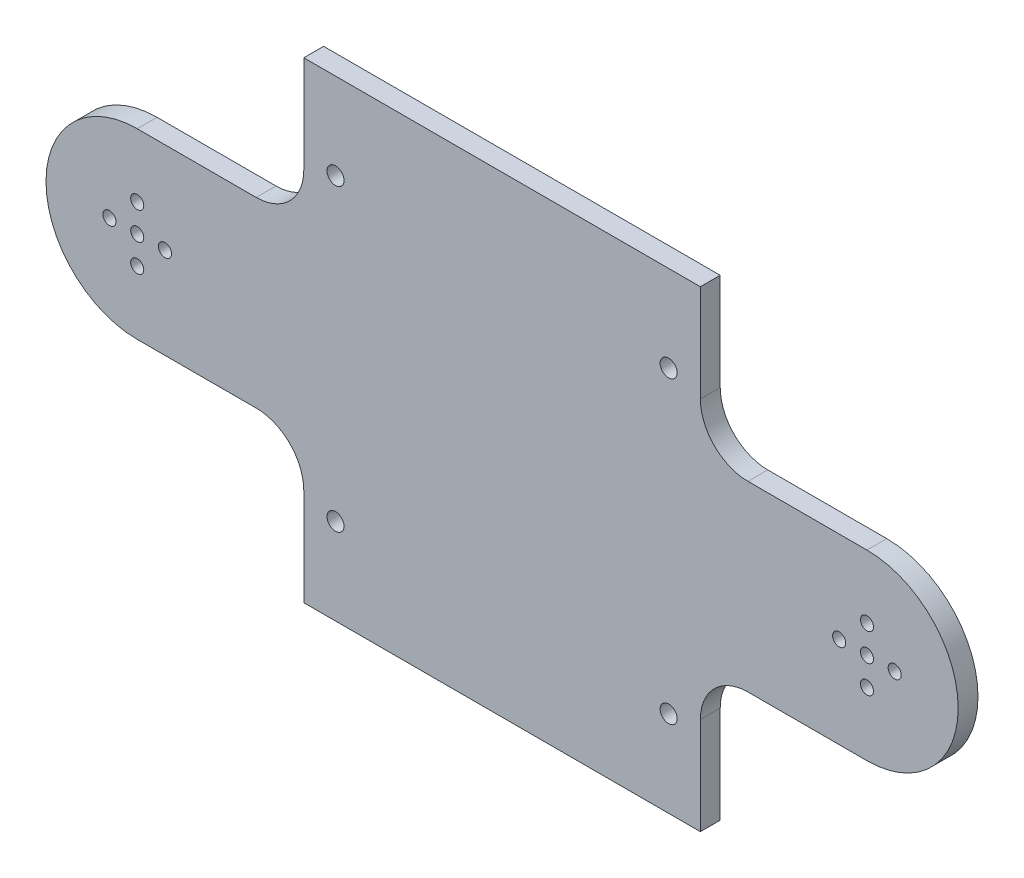
ISO-10303-21;
HEADER;
FILE_DESCRIPTION(('STEP AP214'),'2;1');
FILE_NAME('part.step','',(''),(''),'','','');
FILE_SCHEMA(('AUTOMOTIVE_DESIGN { 1 0 10303 214 1 1 1 1 }'));
ENDSEC;
DATA;
#1=APPLICATION_CONTEXT('core data for automotive mechanical design processes');
#2=APPLICATION_PROTOCOL_DEFINITION('international standard','automotive_design',2000,#1);
#3=PRODUCT_CONTEXT('',#1,'mechanical');
#4=PRODUCT('Part','Part','',(#3));
#5=PRODUCT_RELATED_PRODUCT_CATEGORY('part','',(#4));
#6=PRODUCT_DEFINITION_FORMATION('','',#4);
#7=PRODUCT_DEFINITION_CONTEXT('part definition',#1,'design');
#8=PRODUCT_DEFINITION('design','',#6,#7);
#9=PRODUCT_DEFINITION_SHAPE('','',#8);
#10=(LENGTH_UNIT() NAMED_UNIT(*) SI_UNIT(.MILLI.,.METRE.));
#11=(NAMED_UNIT(*) PLANE_ANGLE_UNIT() SI_UNIT($,.RADIAN.));
#12=(NAMED_UNIT(*) SI_UNIT($,.STERADIAN.) SOLID_ANGLE_UNIT());
#13=UNCERTAINTY_MEASURE_WITH_UNIT(LENGTH_MEASURE(1.E-05),#10,'distance_accuracy_value','');
#14=(GEOMETRIC_REPRESENTATION_CONTEXT(3) GLOBAL_UNCERTAINTY_ASSIGNED_CONTEXT((#13)) GLOBAL_UNIT_ASSIGNED_CONTEXT((#10,
#11,#12)) REPRESENTATION_CONTEXT('',''));
#15=CARTESIAN_POINT('',(0.,0.,0.));
#16=DIRECTION('',(0.,0.,1.));
#17=DIRECTION('',(1.,0.,0.));
#18=AXIS2_PLACEMENT_3D('',#15,#16,#17);
#19=CARTESIAN_POINT('',(-70.9669552143138,59.5010284958712,-0.00999999999999959));
#20=DIRECTION('',(0.,-1.,0.));
#21=DIRECTION('',(0.,0.,-1.));
#22=AXIS2_PLACEMENT_3D('',#19,#20,#21);
#23=PLANE('',#22);
#24=DIRECTION('',(1.,0.,0.));
#25=VECTOR('',#24,1.);
#26=CARTESIAN_POINT('',(-92.,59.5010284958712,0.));
#27=LINE('',#26,#25);
#28=CARTESIAN_POINT('',(-50.,59.5010284958712,0.));
#29=VERTEX_POINT('',#28);
#30=CARTESIAN_POINT('',(50.,59.5010284958712,0.));
#31=VERTEX_POINT('',#30);
#32=EDGE_CURVE('E205',#29,#31,#27,.T.);
#33=ORIENTED_EDGE('',*,*,#32,.F.);
#34=DIRECTION('',(0.,0.,-1.));
#35=VECTOR('',#34,1.);
#36=CARTESIAN_POINT('',(-50.,59.5010284958712,5.));
#37=LINE('',#36,#35);
#38=CARTESIAN_POINT('',(-50.,59.5010284958712,5.));
#39=VERTEX_POINT('',#38);
#40=EDGE_CURVE('E187',#39,#29,#37,.T.);
#41=ORIENTED_EDGE('',*,*,#40,.F.);
#42=DIRECTION('',(1.,0.,0.));
#43=VECTOR('',#42,1.);
#44=CARTESIAN_POINT('',(-92.,59.5010284958712,5.));
#45=LINE('',#44,#43);
#46=CARTESIAN_POINT('',(50.,59.5010284958712,5.));
#47=VERTEX_POINT('',#46);
#48=EDGE_CURVE('E197',#39,#47,#45,.T.);
#49=ORIENTED_EDGE('',*,*,#48,.T.);
#50=DIRECTION('',(0.,0.,1.));
#51=VECTOR('',#50,1.);
#52=CARTESIAN_POINT('',(50.,59.5010284958712,5.));
#53=LINE('',#52,#51);
#54=EDGE_CURVE('E191',#31,#47,#53,.T.);
#55=ORIENTED_EDGE('',*,*,#54,.F.);
#56=EDGE_LOOP('',(#33,#41,#49,#55));
#57=FACE_BOUND('',#56,.T.);
#58=ADVANCED_FACE('F43',(#57),#23,.F.);
#59=CARTESIAN_POINT('',(-70.9669552143138,-59.5010284958712,-0.00999999999999959));
#60=DIRECTION('',(0.,-1.,0.));
#61=DIRECTION('',(0.,0.,-1.));
#62=AXIS2_PLACEMENT_3D('',#59,#60,#61);
#63=PLANE('',#62);
#64=DIRECTION('',(1.,0.,0.));
#65=VECTOR('',#64,1.);
#66=CARTESIAN_POINT('',(-92.,-59.5010284958712,5.));
#67=LINE('',#66,#65);
#68=CARTESIAN_POINT('',(-50.,-59.5010284958712,5.));
#69=VERTEX_POINT('',#68);
#70=CARTESIAN_POINT('',(50.,-59.5010284958712,5.));
#71=VERTEX_POINT('',#70);
#72=EDGE_CURVE('E202',#69,#71,#67,.T.);
#73=ORIENTED_EDGE('',*,*,#72,.F.);
#74=DIRECTION('',(0.,0.,-1.));
#75=VECTOR('',#74,1.);
#76=CARTESIAN_POINT('',(-50.,-59.5010284958712,5.));
#77=LINE('',#76,#75);
#78=CARTESIAN_POINT('',(-50.,-59.5010284958712,0.));
#79=VERTEX_POINT('',#78);
#80=EDGE_CURVE('E46',#69,#79,#77,.T.);
#81=ORIENTED_EDGE('',*,*,#80,.T.);
#82=DIRECTION('',(1.,0.,0.));
#83=VECTOR('',#82,1.);
#84=CARTESIAN_POINT('',(-92.,-59.5010284958712,0.));
#85=LINE('',#84,#83);
#86=CARTESIAN_POINT('',(50.,-59.5010284958712,0.));
#87=VERTEX_POINT('',#86);
#88=EDGE_CURVE('E201',#79,#87,#85,.T.);
#89=ORIENTED_EDGE('',*,*,#88,.T.);
#90=DIRECTION('',(0.,0.,1.));
#91=VECTOR('',#90,1.);
#92=CARTESIAN_POINT('',(50.,-59.5010284958712,5.));
#93=LINE('',#92,#91);
#94=EDGE_CURVE('E11',#87,#71,#93,.T.);
#95=ORIENTED_EDGE('',*,*,#94,.T.);
#96=EDGE_LOOP('',(#73,#81,#89,#95));
#97=FACE_BOUND('',#96,.T.);
#98=ADVANCED_FACE('F216',(#97),#63,.T.);
#99=CARTESIAN_POINT('',(62.,-23.0010284958712,5.));
#100=DIRECTION('',(0.,1.,0.));
#101=DIRECTION('',(-1.,0.,0.));
#102=AXIS2_PLACEMENT_3D('',#99,#100,#101);
#103=PLANE('',#102);
#104=DIRECTION('',(1.,0.,0.));
#105=VECTOR('',#104,1.);
#106=CARTESIAN_POINT('',(62.,-23.0010284958712,0.));
#107=LINE('',#106,#105);
#108=CARTESIAN_POINT('',(62.,-23.0010284958712,0.));
#109=VERTEX_POINT('',#108);
#110=CARTESIAN_POINT('',(92.,-23.0010284958712,0.));
#111=VERTEX_POINT('',#110);
#112=EDGE_CURVE('E359',#109,#111,#107,.T.);
#113=ORIENTED_EDGE('',*,*,#112,.T.);
#114=DIRECTION('',(0.,0.,-1.));
#115=VECTOR('',#114,1.);
#116=CARTESIAN_POINT('',(92.,-23.0010284958712,5.));
#117=LINE('',#116,#115);
#118=CARTESIAN_POINT('',(92.,-23.0010284958712,5.));
#119=VERTEX_POINT('',#118);
#120=EDGE_CURVE('E300',#119,#111,#117,.T.);
#121=ORIENTED_EDGE('',*,*,#120,.F.);
#122=DIRECTION('',(1.,0.,0.));
#123=VECTOR('',#122,1.);
#124=CARTESIAN_POINT('',(62.,-23.0010284958712,5.));
#125=LINE('',#124,#123);
#126=CARTESIAN_POINT('',(62.,-23.0010284958712,5.));
#127=VERTEX_POINT('',#126);
#128=EDGE_CURVE('E333',#127,#119,#125,.T.);
#129=ORIENTED_EDGE('',*,*,#128,.F.);
#130=DIRECTION('',(0.,0.,-1.));
#131=VECTOR('',#130,1.);
#132=CARTESIAN_POINT('',(62.,-23.0010284958712,5.));
#133=LINE('',#132,#131);
#134=EDGE_CURVE('E304',#127,#109,#133,.T.);
#135=ORIENTED_EDGE('',*,*,#134,.T.);
#136=EDGE_LOOP('',(#113,#121,#129,#135));
#137=FACE_BOUND('',#136,.T.);
#138=ADVANCED_FACE('F252',(#137),#103,.F.);
#139=CARTESIAN_POINT('',(92.,0.,5.));
#140=DIRECTION('',(0.,0.,-1.));
#141=DIRECTION('',(-1.,0.,0.));
#142=AXIS2_PLACEMENT_3D('',#139,#140,#141);
#143=CYLINDRICAL_SURFACE('',#142,23.0010284958712);
#144=CARTESIAN_POINT('',(92.,0.,0.));
#145=DIRECTION('',(0.,0.,1.));
#146=DIRECTION('',(-1.,0.,0.));
#147=AXIS2_PLACEMENT_3D('',#144,#145,#146);
#148=CIRCLE('',#147,23.0010284958712);
#149=CARTESIAN_POINT('',(92.,23.0010284958712,0.));
#150=VERTEX_POINT('',#149);
#151=EDGE_CURVE('E362',#111,#150,#148,.T.);
#152=ORIENTED_EDGE('',*,*,#151,.T.);
#153=DIRECTION('',(0.,0.,-1.));
#154=VECTOR('',#153,1.);
#155=CARTESIAN_POINT('',(92.,23.0010284958712,5.));
#156=LINE('',#155,#154);
#157=CARTESIAN_POINT('',(92.,23.0010284958712,5.));
#158=VERTEX_POINT('',#157);
#159=EDGE_CURVE('E296',#158,#150,#156,.T.);
#160=ORIENTED_EDGE('',*,*,#159,.F.);
#161=CARTESIAN_POINT('',(92.,0.,5.));
#162=DIRECTION('',(0.,0.,1.));
#163=DIRECTION('',(-1.,0.,0.));
#164=AXIS2_PLACEMENT_3D('',#161,#162,#163);
#165=CIRCLE('',#164,23.0010284958712);
#166=EDGE_CURVE('E330',#119,#158,#165,.T.);
#167=ORIENTED_EDGE('',*,*,#166,.F.);
#168=ORIENTED_EDGE('',*,*,#120,.T.);
#169=EDGE_LOOP('',(#152,#160,#167,#168));
#170=FACE_BOUND('',#169,.T.);
#171=ADVANCED_FACE('F385',(#170),#143,.T.);
#172=CARTESIAN_POINT('',(62.,23.0010284958712,5.));
#173=DIRECTION('',(0.,-1.,0.));
#174=DIRECTION('',(1.,0.,0.));
#175=AXIS2_PLACEMENT_3D('',#172,#173,#174);
#176=PLANE('',#175);
#177=DIRECTION('',(-1.,0.,0.));
#178=VECTOR('',#177,1.);
#179=CARTESIAN_POINT('',(62.,23.0010284958712,0.));
#180=LINE('',#179,#178);
#181=CARTESIAN_POINT('',(62.,23.0010284958712,0.));
#182=VERTEX_POINT('',#181);
#183=EDGE_CURVE('E365',#150,#182,#180,.T.);
#184=ORIENTED_EDGE('',*,*,#183,.T.);
#185=DIRECTION('',(0.,0.,-1.));
#186=VECTOR('',#185,1.);
#187=CARTESIAN_POINT('',(62.,23.0010284958712,5.));
#188=LINE('',#187,#186);
#189=CARTESIAN_POINT('',(62.,23.0010284958712,5.));
#190=VERTEX_POINT('',#189);
#191=EDGE_CURVE('E292',#190,#182,#188,.T.);
#192=ORIENTED_EDGE('',*,*,#191,.F.);
#193=DIRECTION('',(-1.,0.,0.));
#194=VECTOR('',#193,1.);
#195=CARTESIAN_POINT('',(62.,23.0010284958712,5.));
#196=LINE('',#195,#194);
#197=EDGE_CURVE('E327',#158,#190,#196,.T.);
#198=ORIENTED_EDGE('',*,*,#197,.F.);
#199=ORIENTED_EDGE('',*,*,#159,.T.);
#200=EDGE_LOOP('',(#184,#192,#198,#199));
#201=FACE_BOUND('',#200,.T.);
#202=ADVANCED_FACE('F381',(#201),#176,.F.);
#203=CARTESIAN_POINT('',(-62.,23.0010284958712,5.));
#204=DIRECTION('',(0.,-1.,0.));
#205=DIRECTION('',(1.,0.,0.));
#206=AXIS2_PLACEMENT_3D('',#203,#204,#205);
#207=PLANE('',#206);
#208=DIRECTION('',(-1.,0.,0.));
#209=VECTOR('',#208,1.);
#210=CARTESIAN_POINT('',(-62.,23.0010284958712,0.));
#211=LINE('',#210,#209);
#212=CARTESIAN_POINT('',(-62.,23.0010284958712,0.));
#213=VERTEX_POINT('',#212);
#214=CARTESIAN_POINT('',(-92.,23.0010284958712,0.));
#215=VERTEX_POINT('',#214);
#216=EDGE_CURVE('E181',#213,#215,#211,.T.);
#217=ORIENTED_EDGE('',*,*,#216,.T.);
#218=DIRECTION('',(0.,0.,-1.));
#219=VECTOR('',#218,1.);
#220=CARTESIAN_POINT('',(-92.,23.0010284958712,5.));
#221=LINE('',#220,#219);
#222=CARTESIAN_POINT('',(-92.,23.0010284958712,5.));
#223=VERTEX_POINT('',#222);
#224=EDGE_CURVE('E278',#223,#215,#221,.T.);
#225=ORIENTED_EDGE('',*,*,#224,.F.);
#226=DIRECTION('',(-1.,0.,0.));
#227=VECTOR('',#226,1.);
#228=CARTESIAN_POINT('',(-62.,23.0010284958712,5.));
#229=LINE('',#228,#227);
#230=CARTESIAN_POINT('',(-62.,23.0010284958712,5.));
#231=VERTEX_POINT('',#230);
#232=EDGE_CURVE('E176',#231,#223,#229,.T.);
#233=ORIENTED_EDGE('',*,*,#232,.F.);
#234=DIRECTION('',(0.,0.,-1.));
#235=VECTOR('',#234,1.);
#236=CARTESIAN_POINT('',(-62.,23.0010284958712,5.));
#237=LINE('',#236,#235);
#238=EDGE_CURVE('E281',#231,#213,#237,.T.);
#239=ORIENTED_EDGE('',*,*,#238,.T.);
#240=EDGE_LOOP('',(#217,#225,#233,#239));
#241=FACE_BOUND('',#240,.T.);
#242=ADVANCED_FACE('F414',(#241),#207,.F.);
#243=CARTESIAN_POINT('',(-92.,0.,5.));
#244=DIRECTION('',(0.,0.,-1.));
#245=DIRECTION('',(-1.,0.,0.));
#246=AXIS2_PLACEMENT_3D('',#243,#244,#245);
#247=CYLINDRICAL_SURFACE('',#246,23.0010284958712);
#248=CARTESIAN_POINT('',(-92.,0.,0.));
#249=DIRECTION('',(0.,0.,1.));
#250=DIRECTION('',(1.,0.,0.));
#251=AXIS2_PLACEMENT_3D('',#248,#249,#250);
#252=CIRCLE('',#251,23.0010284958712);
#253=CARTESIAN_POINT('',(-92.,-23.0010284958712,0.));
#254=VERTEX_POINT('',#253);
#255=EDGE_CURVE('E185',#215,#254,#252,.T.);
#256=ORIENTED_EDGE('',*,*,#255,.T.);
#257=DIRECTION('',(0.,0.,-1.));
#258=VECTOR('',#257,1.);
#259=CARTESIAN_POINT('',(-92.,-23.0010284958712,5.));
#260=LINE('',#259,#258);
#261=CARTESIAN_POINT('',(-92.,-23.0010284958712,5.));
#262=VERTEX_POINT('',#261);
#263=EDGE_CURVE('E163',#262,#254,#260,.T.);
#264=ORIENTED_EDGE('',*,*,#263,.F.);
#265=CARTESIAN_POINT('',(-92.,0.,5.));
#266=DIRECTION('',(0.,0.,1.));
#267=DIRECTION('',(1.,0.,0.));
#268=AXIS2_PLACEMENT_3D('',#265,#266,#267);
#269=CIRCLE('',#268,23.0010284958712);
#270=EDGE_CURVE('E171',#223,#262,#269,.T.);
#271=ORIENTED_EDGE('',*,*,#270,.F.);
#272=ORIENTED_EDGE('',*,*,#224,.T.);
#273=EDGE_LOOP('',(#256,#264,#271,#272));
#274=FACE_BOUND('',#273,.T.);
#275=ADVANCED_FACE('F183',(#274),#247,.T.);
#276=CARTESIAN_POINT('',(-62.,-23.0010284958712,5.));
#277=DIRECTION('',(0.,1.,0.));
#278=DIRECTION('',(-1.,0.,0.));
#279=AXIS2_PLACEMENT_3D('',#276,#277,#278);
#280=PLANE('',#279);
#281=DIRECTION('',(1.,0.,0.));
#282=VECTOR('',#281,1.);
#283=CARTESIAN_POINT('',(-62.,-23.0010284958712,0.));
#284=LINE('',#283,#282);
#285=CARTESIAN_POINT('',(-62.,-23.0010284958712,0.));
#286=VERTEX_POINT('',#285);
#287=EDGE_CURVE('E348',#254,#286,#284,.T.);
#288=ORIENTED_EDGE('',*,*,#287,.T.);
#289=DIRECTION('',(0.,0.,-1.));
#290=VECTOR('',#289,1.);
#291=CARTESIAN_POINT('',(-62.,-23.0010284958712,5.));
#292=LINE('',#291,#290);
#293=CARTESIAN_POINT('',(-62.,-23.0010284958712,5.));
#294=VERTEX_POINT('',#293);
#295=EDGE_CURVE('E166',#294,#286,#292,.T.);
#296=ORIENTED_EDGE('',*,*,#295,.F.);
#297=DIRECTION('',(1.,0.,0.));
#298=VECTOR('',#297,1.);
#299=CARTESIAN_POINT('',(-62.,-23.0010284958712,5.));
#300=LINE('',#299,#298);
#301=EDGE_CURVE('E159',#262,#294,#300,.T.);
#302=ORIENTED_EDGE('',*,*,#301,.F.);
#303=ORIENTED_EDGE('',*,*,#263,.T.);
#304=EDGE_LOOP('',(#288,#296,#302,#303));
#305=FACE_BOUND('',#304,.T.);
#306=ADVANCED_FACE('F161',(#305),#280,.F.);
#307=CARTESIAN_POINT('',(42.,-37.748971504128,0.));
#308=DIRECTION('',(0.,0.,1.));
#309=DIRECTION('',(1.,0.,0.));
#310=AXIS2_PLACEMENT_3D('',#307,#308,#309);
#311=CYLINDRICAL_SURFACE('',#310,2.15);
#312=CARTESIAN_POINT('',(42.,-37.748971504128,0.));
#313=DIRECTION('',(0.,0.,1.));
#314=DIRECTION('',(-1.,0.,0.));
#315=AXIS2_PLACEMENT_3D('',#312,#313,#314);
#316=CIRCLE('',#315,2.15);
#317=CARTESIAN_POINT('',(39.85,-37.748971504128,0.));
#318=VERTEX_POINT('',#317);
#319=EDGE_CURVE('E834',#318,#318,#316,.T.);
#320=ORIENTED_EDGE('',*,*,#319,.F.);
#321=EDGE_LOOP('',(#320));
#322=FACE_BOUND('',#321,.T.);
#323=CARTESIAN_POINT('',(42.,-37.748971504128,5.));
#324=DIRECTION('',(0.,0.,1.));
#325=DIRECTION('',(-1.,0.,0.));
#326=AXIS2_PLACEMENT_3D('',#323,#324,#325);
#327=CIRCLE('',#326,2.15);
#328=CARTESIAN_POINT('',(39.85,-37.748971504128,5.));
#329=VERTEX_POINT('',#328);
#330=EDGE_CURVE('E836',#329,#329,#327,.T.);
#331=ORIENTED_EDGE('',*,*,#330,.T.);
#332=EDGE_LOOP('',(#331));
#333=FACE_BOUND('',#332,.T.);
#334=ADVANCED_FACE('F412',(#322,#333),#311,.F.);
#335=CARTESIAN_POINT('',(42.,37.748971504128,0.));
#336=DIRECTION('',(0.,0.,1.));
#337=DIRECTION('',(1.,0.,0.));
#338=AXIS2_PLACEMENT_3D('',#335,#336,#337);
#339=CYLINDRICAL_SURFACE('',#338,2.15);
#340=CARTESIAN_POINT('',(42.,37.748971504128,0.));
#341=DIRECTION('',(0.,0.,1.));
#342=DIRECTION('',(1.,0.,0.));
#343=AXIS2_PLACEMENT_3D('',#340,#341,#342);
#344=CIRCLE('',#343,2.15);
#345=CARTESIAN_POINT('',(44.15,37.748971504128,0.));
#346=VERTEX_POINT('',#345);
#347=EDGE_CURVE('E831',#346,#346,#344,.T.);
#348=ORIENTED_EDGE('',*,*,#347,.F.);
#349=EDGE_LOOP('',(#348));
#350=FACE_BOUND('',#349,.T.);
#351=CARTESIAN_POINT('',(42.,37.748971504128,5.));
#352=DIRECTION('',(0.,0.,1.));
#353=DIRECTION('',(1.,0.,0.));
#354=AXIS2_PLACEMENT_3D('',#351,#352,#353);
#355=CIRCLE('',#354,2.15);
#356=CARTESIAN_POINT('',(44.15,37.748971504128,5.));
#357=VERTEX_POINT('',#356);
#358=EDGE_CURVE('E837',#357,#357,#355,.T.);
#359=ORIENTED_EDGE('',*,*,#358,.T.);
#360=EDGE_LOOP('',(#359));
#361=FACE_BOUND('',#360,.T.);
#362=ADVANCED_FACE('F476',(#350,#361),#339,.F.);
#363=CARTESIAN_POINT('',(-42.,37.748971504128,0.));
#364=DIRECTION('',(0.,0.,1.));
#365=DIRECTION('',(1.,0.,0.));
#366=AXIS2_PLACEMENT_3D('',#363,#364,#365);
#367=CYLINDRICAL_SURFACE('',#366,2.15);
#368=CARTESIAN_POINT('',(-42.,37.748971504128,0.));
#369=DIRECTION('',(0.,0.,1.));
#370=DIRECTION('',(-1.,0.,0.));
#371=AXIS2_PLACEMENT_3D('',#368,#369,#370);
#372=CIRCLE('',#371,2.15);
#373=CARTESIAN_POINT('',(-44.15,37.748971504128,0.));
#374=VERTEX_POINT('',#373);
#375=EDGE_CURVE('E827',#374,#374,#372,.T.);
#376=ORIENTED_EDGE('',*,*,#375,.F.);
#377=EDGE_LOOP('',(#376));
#378=FACE_BOUND('',#377,.T.);
#379=CARTESIAN_POINT('',(-42.,37.748971504128,5.));
#380=DIRECTION('',(0.,0.,1.));
#381=DIRECTION('',(-1.,0.,0.));
#382=AXIS2_PLACEMENT_3D('',#379,#380,#381);
#383=CIRCLE('',#382,2.15);
#384=CARTESIAN_POINT('',(-44.15,37.748971504128,5.));
#385=VERTEX_POINT('',#384);
#386=EDGE_CURVE('E848',#385,#385,#383,.T.);
#387=ORIENTED_EDGE('',*,*,#386,.T.);
#388=EDGE_LOOP('',(#387));
#389=FACE_BOUND('',#388,.T.);
#390=ADVANCED_FACE('F488',(#378,#389),#367,.F.);
#391=CARTESIAN_POINT('',(-42.,-37.748971504128,0.));
#392=DIRECTION('',(0.,0.,1.));
#393=DIRECTION('',(1.,0.,0.));
#394=AXIS2_PLACEMENT_3D('',#391,#392,#393);
#395=CYLINDRICAL_SURFACE('',#394,2.15);
#396=CARTESIAN_POINT('',(-42.,-37.748971504128,0.));
#397=DIRECTION('',(0.,0.,1.));
#398=DIRECTION('',(1.,0.,0.));
#399=AXIS2_PLACEMENT_3D('',#396,#397,#398);
#400=CIRCLE('',#399,2.15);
#401=CARTESIAN_POINT('',(-39.85,-37.748971504128,0.));
#402=VERTEX_POINT('',#401);
#403=EDGE_CURVE('E738',#402,#402,#400,.T.);
#404=ORIENTED_EDGE('',*,*,#403,.F.);
#405=EDGE_LOOP('',(#404));
#406=FACE_BOUND('',#405,.T.);
#407=CARTESIAN_POINT('',(-42.,-37.748971504128,5.));
#408=DIRECTION('',(0.,0.,1.));
#409=DIRECTION('',(1.,0.,0.));
#410=AXIS2_PLACEMENT_3D('',#407,#408,#409);
#411=CIRCLE('',#410,2.15);
#412=CARTESIAN_POINT('',(-39.85,-37.748971504128,5.));
#413=VERTEX_POINT('',#412);
#414=EDGE_CURVE('E745',#413,#413,#411,.T.);
#415=ORIENTED_EDGE('',*,*,#414,.T.);
#416=EDGE_LOOP('',(#415));
#417=FACE_BOUND('',#416,.T.);
#418=ADVANCED_FACE('F499',(#406,#417),#395,.F.);
#419=CARTESIAN_POINT('',(-92.,0.,5.));
#420=DIRECTION('',(0.,0.,-1.));
#421=DIRECTION('',(-1.,0.,0.));
#422=AXIS2_PLACEMENT_3D('',#419,#420,#421);
#423=CYLINDRICAL_SURFACE('',#422,1.65);
#424=CARTESIAN_POINT('',(-92.,0.,5.));
#425=DIRECTION('',(0.,0.,1.));
#426=DIRECTION('',(1.,0.,0.));
#427=AXIS2_PLACEMENT_3D('',#424,#425,#426);
#428=CIRCLE('',#427,1.65);
#429=CARTESIAN_POINT('',(-90.35,0.,5.));
#430=VERTEX_POINT('',#429);
#431=EDGE_CURVE('E349',#430,#430,#428,.T.);
#432=ORIENTED_EDGE('',*,*,#431,.T.);
#433=EDGE_LOOP('',(#432));
#434=FACE_BOUND('',#433,.T.);
#435=CARTESIAN_POINT('',(-92.,0.,0.));
#436=DIRECTION('',(0.,0.,1.));
#437=DIRECTION('',(1.,0.,0.));
#438=AXIS2_PLACEMENT_3D('',#435,#436,#437);
#439=CIRCLE('',#438,1.65);
#440=CARTESIAN_POINT('',(-90.35,0.,0.));
#441=VERTEX_POINT('',#440);
#442=EDGE_CURVE('E809',#441,#441,#439,.T.);
#443=ORIENTED_EDGE('',*,*,#442,.F.);
#444=EDGE_LOOP('',(#443));
#445=FACE_BOUND('',#444,.T.);
#446=ADVANCED_FACE('F509',(#434,#445),#423,.F.);
#447=CARTESIAN_POINT('',(92.,0.,5.));
#448=DIRECTION('',(0.,0.,-1.));
#449=DIRECTION('',(-1.,0.,0.));
#450=AXIS2_PLACEMENT_3D('',#447,#448,#449);
#451=CYLINDRICAL_SURFACE('',#450,1.65);
#452=CARTESIAN_POINT('',(92.,0.,5.));
#453=DIRECTION('',(0.,0.,1.));
#454=DIRECTION('',(-1.,0.,0.));
#455=AXIS2_PLACEMENT_3D('',#452,#453,#454);
#456=CIRCLE('',#455,1.65);
#457=CARTESIAN_POINT('',(90.35,0.,5.));
#458=VERTEX_POINT('',#457);
#459=EDGE_CURVE('E805',#458,#458,#456,.T.);
#460=ORIENTED_EDGE('',*,*,#459,.T.);
#461=EDGE_LOOP('',(#460));
#462=FACE_BOUND('',#461,.T.);
#463=CARTESIAN_POINT('',(92.,0.,0.));
#464=DIRECTION('',(0.,0.,1.));
#465=DIRECTION('',(-1.,0.,0.));
#466=AXIS2_PLACEMENT_3D('',#463,#464,#465);
#467=CIRCLE('',#466,1.65);
#468=CARTESIAN_POINT('',(90.35,0.,0.));
#469=VERTEX_POINT('',#468);
#470=EDGE_CURVE('E801',#469,#469,#467,.T.);
#471=ORIENTED_EDGE('',*,*,#470,.F.);
#472=EDGE_LOOP('',(#471));
#473=FACE_BOUND('',#472,.T.);
#474=ADVANCED_FACE('F520',(#462,#473),#451,.F.);
#475=CARTESIAN_POINT('',(-92.,7.0010284958712,5.));
#476=DIRECTION('',(0.,0.,-1.));
#477=DIRECTION('',(-1.,0.,0.));
#478=AXIS2_PLACEMENT_3D('',#475,#476,#477);
#479=CYLINDRICAL_SURFACE('',#478,1.65);
#480=CARTESIAN_POINT('',(-92.,7.0010284958712,5.));
#481=DIRECTION('',(0.,0.,1.));
#482=DIRECTION('',(1.,0.,0.));
#483=AXIS2_PLACEMENT_3D('',#480,#481,#482);
#484=CIRCLE('',#483,1.65);
#485=CARTESIAN_POINT('',(-90.35,7.0010284958712,5.));
#486=VERTEX_POINT('',#485);
#487=EDGE_CURVE('E797',#486,#486,#484,.T.);
#488=ORIENTED_EDGE('',*,*,#487,.T.);
#489=EDGE_LOOP('',(#488));
#490=FACE_BOUND('',#489,.T.);
#491=CARTESIAN_POINT('',(-92.,7.0010284958712,0.));
#492=DIRECTION('',(0.,0.,1.));
#493=DIRECTION('',(1.,0.,0.));
#494=AXIS2_PLACEMENT_3D('',#491,#492,#493);
#495=CIRCLE('',#494,1.65);
#496=CARTESIAN_POINT('',(-90.35,7.0010284958712,0.));
#497=VERTEX_POINT('',#496);
#498=EDGE_CURVE('E793',#497,#497,#495,.T.);
#499=ORIENTED_EDGE('',*,*,#498,.F.);
#500=EDGE_LOOP('',(#499));
#501=FACE_BOUND('',#500,.T.);
#502=ADVANCED_FACE('F531',(#490,#501),#479,.F.);
#503=CARTESIAN_POINT('',(-84.9989715041288,0.,5.));
#504=DIRECTION('',(0.,0.,-1.));
#505=DIRECTION('',(-1.,0.,0.));
#506=AXIS2_PLACEMENT_3D('',#503,#504,#505);
#507=CYLINDRICAL_SURFACE('',#506,1.65);
#508=CARTESIAN_POINT('',(-84.9989715041288,0.,5.));
#509=DIRECTION('',(0.,0.,1.));
#510=DIRECTION('',(1.,0.,0.));
#511=AXIS2_PLACEMENT_3D('',#508,#509,#510);
#512=CIRCLE('',#511,1.65);
#513=CARTESIAN_POINT('',(-83.3489715041288,0.,5.));
#514=VERTEX_POINT('',#513);
#515=EDGE_CURVE('E789',#514,#514,#512,.T.);
#516=ORIENTED_EDGE('',*,*,#515,.T.);
#517=EDGE_LOOP('',(#516));
#518=FACE_BOUND('',#517,.T.);
#519=CARTESIAN_POINT('',(-84.9989715041288,0.,0.));
#520=DIRECTION('',(0.,0.,1.));
#521=DIRECTION('',(1.,0.,0.));
#522=AXIS2_PLACEMENT_3D('',#519,#520,#521);
#523=CIRCLE('',#522,1.65);
#524=CARTESIAN_POINT('',(-83.3489715041288,0.,0.));
#525=VERTEX_POINT('',#524);
#526=EDGE_CURVE('E785',#525,#525,#523,.T.);
#527=ORIENTED_EDGE('',*,*,#526,.F.);
#528=EDGE_LOOP('',(#527));
#529=FACE_BOUND('',#528,.T.);
#530=ADVANCED_FACE('F542',(#518,#529),#507,.F.);
#531=CARTESIAN_POINT('',(-92.,-7.0010284958712,5.));
#532=DIRECTION('',(0.,0.,-1.));
#533=DIRECTION('',(-1.,0.,0.));
#534=AXIS2_PLACEMENT_3D('',#531,#532,#533);
#535=CYLINDRICAL_SURFACE('',#534,1.65);
#536=CARTESIAN_POINT('',(-92.,-7.0010284958712,5.));
#537=DIRECTION('',(0.,0.,1.));
#538=DIRECTION('',(1.,0.,0.));
#539=AXIS2_PLACEMENT_3D('',#536,#537,#538);
#540=CIRCLE('',#539,1.65);
#541=CARTESIAN_POINT('',(-90.35,-7.0010284958712,5.));
#542=VERTEX_POINT('',#541);
#543=EDGE_CURVE('E781',#542,#542,#540,.T.);
#544=ORIENTED_EDGE('',*,*,#543,.T.);
#545=EDGE_LOOP('',(#544));
#546=FACE_BOUND('',#545,.T.);
#547=CARTESIAN_POINT('',(-92.,-7.0010284958712,0.));
#548=DIRECTION('',(0.,0.,1.));
#549=DIRECTION('',(1.,0.,0.));
#550=AXIS2_PLACEMENT_3D('',#547,#548,#549);
#551=CIRCLE('',#550,1.65);
#552=CARTESIAN_POINT('',(-90.35,-7.0010284958712,0.));
#553=VERTEX_POINT('',#552);
#554=EDGE_CURVE('E777',#553,#553,#551,.T.);
#555=ORIENTED_EDGE('',*,*,#554,.F.);
#556=EDGE_LOOP('',(#555));
#557=FACE_BOUND('',#556,.T.);
#558=ADVANCED_FACE('F553',(#546,#557),#535,.F.);
#559=CARTESIAN_POINT('',(-99.0010284958712,0.,5.));
#560=DIRECTION('',(0.,0.,-1.));
#561=DIRECTION('',(-1.,0.,0.));
#562=AXIS2_PLACEMENT_3D('',#559,#560,#561);
#563=CYLINDRICAL_SURFACE('',#562,1.65);
#564=CARTESIAN_POINT('',(-99.0010284958712,0.,5.));
#565=DIRECTION('',(0.,0.,1.));
#566=DIRECTION('',(1.,0.,0.));
#567=AXIS2_PLACEMENT_3D('',#564,#565,#566);
#568=CIRCLE('',#567,1.65);
#569=CARTESIAN_POINT('',(-97.3510284958712,0.,5.));
#570=VERTEX_POINT('',#569);
#571=EDGE_CURVE('E773',#570,#570,#568,.T.);
#572=ORIENTED_EDGE('',*,*,#571,.T.);
#573=EDGE_LOOP('',(#572));
#574=FACE_BOUND('',#573,.T.);
#575=CARTESIAN_POINT('',(-99.0010284958712,0.,0.));
#576=DIRECTION('',(0.,0.,1.));
#577=DIRECTION('',(1.,0.,0.));
#578=AXIS2_PLACEMENT_3D('',#575,#576,#577);
#579=CIRCLE('',#578,1.65);
#580=CARTESIAN_POINT('',(-97.3510284958712,0.,0.));
#581=VERTEX_POINT('',#580);
#582=EDGE_CURVE('E769',#581,#581,#579,.T.);
#583=ORIENTED_EDGE('',*,*,#582,.F.);
#584=EDGE_LOOP('',(#583));
#585=FACE_BOUND('',#584,.T.);
#586=ADVANCED_FACE('F564',(#574,#585),#563,.F.);
#587=CARTESIAN_POINT('',(99.0010284958712,0.,5.));
#588=DIRECTION('',(0.,0.,-1.));
#589=DIRECTION('',(-1.,0.,0.));
#590=AXIS2_PLACEMENT_3D('',#587,#588,#589);
#591=CYLINDRICAL_SURFACE('',#590,1.65);
#592=CARTESIAN_POINT('',(99.0010284958712,0.,5.));
#593=DIRECTION('',(0.,0.,1.));
#594=DIRECTION('',(-1.,0.,0.));
#595=AXIS2_PLACEMENT_3D('',#592,#593,#594);
#596=CIRCLE('',#595,1.65);
#597=CARTESIAN_POINT('',(97.3510284958712,0.,5.));
#598=VERTEX_POINT('',#597);
#599=EDGE_CURVE('E765',#598,#598,#596,.T.);
#600=ORIENTED_EDGE('',*,*,#599,.T.);
#601=EDGE_LOOP('',(#600));
#602=FACE_BOUND('',#601,.T.);
#603=CARTESIAN_POINT('',(99.0010284958712,0.,0.));
#604=DIRECTION('',(0.,0.,1.));
#605=DIRECTION('',(-1.,0.,0.));
#606=AXIS2_PLACEMENT_3D('',#603,#604,#605);
#607=CIRCLE('',#606,1.65);
#608=CARTESIAN_POINT('',(97.3510284958712,0.,0.));
#609=VERTEX_POINT('',#608);
#610=EDGE_CURVE('E761',#609,#609,#607,.T.);
#611=ORIENTED_EDGE('',*,*,#610,.F.);
#612=EDGE_LOOP('',(#611));
#613=FACE_BOUND('',#612,.T.);
#614=ADVANCED_FACE('F575',(#602,#613),#591,.F.);
#615=CARTESIAN_POINT('',(92.,-7.0010284958712,5.));
#616=DIRECTION('',(0.,0.,-1.));
#617=DIRECTION('',(-1.,0.,0.));
#618=AXIS2_PLACEMENT_3D('',#615,#616,#617);
#619=CYLINDRICAL_SURFACE('',#618,1.65);
#620=CARTESIAN_POINT('',(92.,-7.0010284958712,5.));
#621=DIRECTION('',(0.,0.,1.));
#622=DIRECTION('',(-1.,0.,0.));
#623=AXIS2_PLACEMENT_3D('',#620,#621,#622);
#624=CIRCLE('',#623,1.65);
#625=CARTESIAN_POINT('',(90.35,-7.0010284958712,5.));
#626=VERTEX_POINT('',#625);
#627=EDGE_CURVE('E757',#626,#626,#624,.T.);
#628=ORIENTED_EDGE('',*,*,#627,.T.);
#629=EDGE_LOOP('',(#628));
#630=FACE_BOUND('',#629,.T.);
#631=CARTESIAN_POINT('',(92.,-7.0010284958712,0.));
#632=DIRECTION('',(0.,0.,1.));
#633=DIRECTION('',(-1.,0.,0.));
#634=AXIS2_PLACEMENT_3D('',#631,#632,#633);
#635=CIRCLE('',#634,1.65);
#636=CARTESIAN_POINT('',(90.35,-7.0010284958712,0.));
#637=VERTEX_POINT('',#636);
#638=EDGE_CURVE('E753',#637,#637,#635,.T.);
#639=ORIENTED_EDGE('',*,*,#638,.F.);
#640=EDGE_LOOP('',(#639));
#641=FACE_BOUND('',#640,.T.);
#642=ADVANCED_FACE('F586',(#630,#641),#619,.F.);
#643=CARTESIAN_POINT('',(84.9989715041288,0.,5.));
#644=DIRECTION('',(0.,0.,-1.));
#645=DIRECTION('',(-1.,0.,0.));
#646=AXIS2_PLACEMENT_3D('',#643,#644,#645);
#647=CYLINDRICAL_SURFACE('',#646,1.65);
#648=CARTESIAN_POINT('',(84.9989715041288,0.,5.));
#649=DIRECTION('',(0.,0.,1.));
#650=DIRECTION('',(-1.,0.,0.));
#651=AXIS2_PLACEMENT_3D('',#648,#649,#650);
#652=CIRCLE('',#651,1.65);
#653=CARTESIAN_POINT('',(83.3489715041288,0.,5.));
#654=VERTEX_POINT('',#653);
#655=EDGE_CURVE('E749',#654,#654,#652,.T.);
#656=ORIENTED_EDGE('',*,*,#655,.T.);
#657=EDGE_LOOP('',(#656));
#658=FACE_BOUND('',#657,.T.);
#659=CARTESIAN_POINT('',(84.9989715041288,0.,0.));
#660=DIRECTION('',(0.,0.,1.));
#661=DIRECTION('',(-1.,0.,0.));
#662=AXIS2_PLACEMENT_3D('',#659,#660,#661);
#663=CIRCLE('',#662,1.65);
#664=CARTESIAN_POINT('',(83.3489715041288,0.,0.));
#665=VERTEX_POINT('',#664);
#666=EDGE_CURVE('E742',#665,#665,#663,.T.);
#667=ORIENTED_EDGE('',*,*,#666,.F.);
#668=EDGE_LOOP('',(#667));
#669=FACE_BOUND('',#668,.T.);
#670=ADVANCED_FACE('F597',(#658,#669),#647,.F.);
#671=CARTESIAN_POINT('',(92.,7.0010284958712,5.));
#672=DIRECTION('',(0.,0.,-1.));
#673=DIRECTION('',(-1.,0.,0.));
#674=AXIS2_PLACEMENT_3D('',#671,#672,#673);
#675=CYLINDRICAL_SURFACE('',#674,1.65);
#676=CARTESIAN_POINT('',(92.,7.0010284958712,5.));
#677=DIRECTION('',(0.,0.,1.));
#678=DIRECTION('',(-1.,0.,0.));
#679=AXIS2_PLACEMENT_3D('',#676,#677,#678);
#680=CIRCLE('',#679,1.65);
#681=CARTESIAN_POINT('',(90.35,7.0010284958712,5.));
#682=VERTEX_POINT('',#681);
#683=EDGE_CURVE('E734',#682,#682,#680,.T.);
#684=ORIENTED_EDGE('',*,*,#683,.T.);
#685=EDGE_LOOP('',(#684));
#686=FACE_BOUND('',#685,.T.);
#687=CARTESIAN_POINT('',(92.,7.0010284958712,0.));
#688=DIRECTION('',(0.,0.,1.));
#689=DIRECTION('',(-1.,0.,0.));
#690=AXIS2_PLACEMENT_3D('',#687,#688,#689);
#691=CIRCLE('',#690,1.65);
#692=CARTESIAN_POINT('',(90.35,7.0010284958712,0.));
#693=VERTEX_POINT('',#692);
#694=EDGE_CURVE('E736',#693,#693,#691,.T.);
#695=ORIENTED_EDGE('',*,*,#694,.F.);
#696=EDGE_LOOP('',(#695));
#697=FACE_BOUND('',#696,.T.);
#698=ADVANCED_FACE('F408',(#686,#697),#675,.F.);
#699=CARTESIAN_POINT('',(-62.,-35.0010284958712,5.));
#700=DIRECTION('',(0.,0.,-1.));
#701=DIRECTION('',(-1.,0.,0.));
#702=AXIS2_PLACEMENT_3D('',#699,#700,#701);
#703=CYLINDRICAL_SURFACE('',#702,12.);
#704=CARTESIAN_POINT('',(-62.,-35.0010284958712,0.));
#705=DIRECTION('',(0.,0.,-1.));
#706=DIRECTION('',(-1.,0.,0.));
#707=AXIS2_PLACEMENT_3D('',#704,#705,#706);
#708=CIRCLE('',#707,12.);
#709=CARTESIAN_POINT('',(-50.,-35.0010284958712,0.));
#710=VERTEX_POINT('',#709);
#711=EDGE_CURVE('E227',#286,#710,#708,.T.);
#712=ORIENTED_EDGE('',*,*,#711,.T.);
#713=DIRECTION('',(0.,0.,-1.));
#714=VECTOR('',#713,1.);
#715=CARTESIAN_POINT('',(-50.,-35.0010284958712,5.));
#716=LINE('',#715,#714);
#717=CARTESIAN_POINT('',(-50.,-35.0010284958712,5.));
#718=VERTEX_POINT('',#717);
#719=EDGE_CURVE('E193',#718,#710,#716,.T.);
#720=ORIENTED_EDGE('',*,*,#719,.F.);
#721=CARTESIAN_POINT('',(-62.,-35.0010284958712,5.));
#722=DIRECTION('',(0.,0.,-1.));
#723=DIRECTION('',(-1.,0.,0.));
#724=AXIS2_PLACEMENT_3D('',#721,#722,#723);
#725=CIRCLE('',#724,12.);
#726=EDGE_CURVE('E170',#294,#718,#725,.T.);
#727=ORIENTED_EDGE('',*,*,#726,.F.);
#728=ORIENTED_EDGE('',*,*,#295,.T.);
#729=EDGE_LOOP('',(#712,#720,#727,#728));
#730=FACE_BOUND('',#729,.T.);
#731=ADVANCED_FACE('F405',(#730),#703,.F.);
#732=CARTESIAN_POINT('',(62.,-35.0010284958712,5.));
#733=DIRECTION('',(0.,0.,-1.));
#734=DIRECTION('',(-1.,0.,0.));
#735=AXIS2_PLACEMENT_3D('',#732,#733,#734);
#736=CYLINDRICAL_SURFACE('',#735,12.);
#737=CARTESIAN_POINT('',(62.,-35.0010284958712,0.));
#738=DIRECTION('',(0.,0.,-1.));
#739=DIRECTION('',(1.,0.,0.));
#740=AXIS2_PLACEMENT_3D('',#737,#738,#739);
#741=CIRCLE('',#740,12.);
#742=CARTESIAN_POINT('',(50.,-35.0010284958712,0.));
#743=VERTEX_POINT('',#742);
#744=EDGE_CURVE('E356',#743,#109,#741,.T.);
#745=ORIENTED_EDGE('',*,*,#744,.T.);
#746=ORIENTED_EDGE('',*,*,#134,.F.);
#747=CARTESIAN_POINT('',(62.,-35.0010284958712,5.));
#748=DIRECTION('',(0.,0.,-1.));
#749=DIRECTION('',(1.,0.,0.));
#750=AXIS2_PLACEMENT_3D('',#747,#748,#749);
#751=CIRCLE('',#750,12.);
#752=CARTESIAN_POINT('',(50.,-35.0010284958712,5.));
#753=VERTEX_POINT('',#752);
#754=EDGE_CURVE('E336',#753,#127,#751,.T.);
#755=ORIENTED_EDGE('',*,*,#754,.F.);
#756=DIRECTION('',(0.,0.,-1.));
#757=VECTOR('',#756,1.);
#758=CARTESIAN_POINT('',(50.,-35.0010284958712,5.));
#759=LINE('',#758,#757);
#760=EDGE_CURVE('E308',#753,#743,#759,.T.);
#761=ORIENTED_EDGE('',*,*,#760,.T.);
#762=EDGE_LOOP('',(#745,#746,#755,#761));
#763=FACE_BOUND('',#762,.T.);
#764=ADVANCED_FACE('F392',(#763),#736,.F.);
#765=CARTESIAN_POINT('',(62.,35.0010284958712,5.));
#766=DIRECTION('',(0.,0.,-1.));
#767=DIRECTION('',(-1.,0.,0.));
#768=AXIS2_PLACEMENT_3D('',#765,#766,#767);
#769=CYLINDRICAL_SURFACE('',#768,12.);
#770=CARTESIAN_POINT('',(62.,35.0010284958712,0.));
#771=DIRECTION('',(0.,0.,-1.));
#772=DIRECTION('',(-1.,0.,0.));
#773=AXIS2_PLACEMENT_3D('',#770,#771,#772);
#774=CIRCLE('',#773,12.);
#775=CARTESIAN_POINT('',(50.,35.0010284958712,0.));
#776=VERTEX_POINT('',#775);
#777=EDGE_CURVE('E272',#182,#776,#774,.T.);
#778=ORIENTED_EDGE('',*,*,#777,.T.);
#779=DIRECTION('',(0.,0.,-1.));
#780=VECTOR('',#779,1.);
#781=CARTESIAN_POINT('',(50.,35.0010284958712,5.));
#782=LINE('',#781,#780);
#783=CARTESIAN_POINT('',(50.,35.0010284958712,5.));
#784=VERTEX_POINT('',#783);
#785=EDGE_CURVE('E288',#784,#776,#782,.T.);
#786=ORIENTED_EDGE('',*,*,#785,.F.);
#787=CARTESIAN_POINT('',(62.,35.0010284958712,5.));
#788=DIRECTION('',(0.,0.,-1.));
#789=DIRECTION('',(-1.,0.,0.));
#790=AXIS2_PLACEMENT_3D('',#787,#788,#789);
#791=CIRCLE('',#790,12.);
#792=EDGE_CURVE('E324',#190,#784,#791,.T.);
#793=ORIENTED_EDGE('',*,*,#792,.F.);
#794=ORIENTED_EDGE('',*,*,#191,.T.);
#795=EDGE_LOOP('',(#778,#786,#793,#794));
#796=FACE_BOUND('',#795,.T.);
#797=ADVANCED_FACE('F241',(#796),#769,.F.);
#798=CARTESIAN_POINT('',(-62.,35.0010284958712,5.));
#799=DIRECTION('',(0.,0.,-1.));
#800=DIRECTION('',(-1.,0.,0.));
#801=AXIS2_PLACEMENT_3D('',#798,#799,#800);
#802=CYLINDRICAL_SURFACE('',#801,12.);
#803=CARTESIAN_POINT('',(-62.,35.0010284958712,0.));
#804=DIRECTION('',(0.,0.,-1.));
#805=DIRECTION('',(1.,0.,0.));
#806=AXIS2_PLACEMENT_3D('',#803,#804,#805);
#807=CIRCLE('',#806,12.);
#808=CARTESIAN_POINT('',(-50.,35.0010284958712,0.));
#809=VERTEX_POINT('',#808);
#810=EDGE_CURVE('E262',#809,#213,#807,.T.);
#811=ORIENTED_EDGE('',*,*,#810,.T.);
#812=ORIENTED_EDGE('',*,*,#238,.F.);
#813=CARTESIAN_POINT('',(-62.,35.0010284958712,5.));
#814=DIRECTION('',(0.,0.,-1.));
#815=DIRECTION('',(1.,0.,0.));
#816=AXIS2_PLACEMENT_3D('',#813,#814,#815);
#817=CIRCLE('',#816,12.);
#818=CARTESIAN_POINT('',(-50.,35.0010284958712,5.));
#819=VERTEX_POINT('',#818);
#820=EDGE_CURVE('E314',#819,#231,#817,.T.);
#821=ORIENTED_EDGE('',*,*,#820,.F.);
#822=DIRECTION('',(0.,0.,-1.));
#823=VECTOR('',#822,1.);
#824=CARTESIAN_POINT('',(-50.,35.0010284958712,5.));
#825=LINE('',#824,#823);
#826=EDGE_CURVE('E285',#819,#809,#825,.T.);
#827=ORIENTED_EDGE('',*,*,#826,.T.);
#828=EDGE_LOOP('',(#811,#812,#821,#827));
#829=FACE_BOUND('',#828,.T.);
#830=ADVANCED_FACE('F231',(#829),#802,.F.);
#831=CARTESIAN_POINT('',(-92.,0.,0.));
#832=DIRECTION('',(0.,0.,1.));
#833=DIRECTION('',(1.,0.,0.));
#834=AXIS2_PLACEMENT_3D('',#831,#832,#833);
#835=PLANE('',#834);
#836=ORIENTED_EDGE('',*,*,#694,.T.);
#837=EDGE_LOOP('',(#836));
#838=FACE_BOUND('',#837,.T.);
#839=ORIENTED_EDGE('',*,*,#666,.T.);
#840=EDGE_LOOP('',(#839));
#841=FACE_BOUND('',#840,.T.);
#842=ORIENTED_EDGE('',*,*,#638,.T.);
#843=EDGE_LOOP('',(#842));
#844=FACE_BOUND('',#843,.T.);
#845=ORIENTED_EDGE('',*,*,#610,.T.);
#846=EDGE_LOOP('',(#845));
#847=FACE_BOUND('',#846,.T.);
#848=ORIENTED_EDGE('',*,*,#582,.T.);
#849=EDGE_LOOP('',(#848));
#850=FACE_BOUND('',#849,.T.);
#851=ORIENTED_EDGE('',*,*,#554,.T.);
#852=EDGE_LOOP('',(#851));
#853=FACE_BOUND('',#852,.T.);
#854=ORIENTED_EDGE('',*,*,#526,.T.);
#855=EDGE_LOOP('',(#854));
#856=FACE_BOUND('',#855,.T.);
#857=ORIENTED_EDGE('',*,*,#498,.T.);
#858=EDGE_LOOP('',(#857));
#859=FACE_BOUND('',#858,.T.);
#860=ORIENTED_EDGE('',*,*,#470,.T.);
#861=EDGE_LOOP('',(#860));
#862=FACE_BOUND('',#861,.T.);
#863=ORIENTED_EDGE('',*,*,#442,.T.);
#864=EDGE_LOOP('',(#863));
#865=FACE_BOUND('',#864,.T.);
#866=ORIENTED_EDGE('',*,*,#403,.T.);
#867=EDGE_LOOP('',(#866));
#868=FACE_BOUND('',#867,.T.);
#869=ORIENTED_EDGE('',*,*,#375,.T.);
#870=EDGE_LOOP('',(#869));
#871=FACE_BOUND('',#870,.T.);
#872=ORIENTED_EDGE('',*,*,#347,.T.);
#873=EDGE_LOOP('',(#872));
#874=FACE_BOUND('',#873,.T.);
#875=ORIENTED_EDGE('',*,*,#319,.T.);
#876=EDGE_LOOP('',(#875));
#877=FACE_BOUND('',#876,.T.);
#878=ORIENTED_EDGE('',*,*,#88,.F.);
#879=DIRECTION('',(0.,-1.,0.));
#880=VECTOR('',#879,1.);
#881=CARTESIAN_POINT('',(-50.,-116.998971504128,0.));
#882=LINE('',#881,#880);
#883=EDGE_CURVE('E223',#710,#79,#882,.T.);
#884=ORIENTED_EDGE('',*,*,#883,.F.);
#885=ORIENTED_EDGE('',*,*,#711,.F.);
#886=ORIENTED_EDGE('',*,*,#287,.F.);
#887=ORIENTED_EDGE('',*,*,#255,.F.);
#888=ORIENTED_EDGE('',*,*,#216,.F.);
#889=ORIENTED_EDGE('',*,*,#810,.F.);
#890=DIRECTION('',(0.,-1.,0.));
#891=VECTOR('',#890,1.);
#892=CARTESIAN_POINT('',(-50.,35.0010284958712,0.));
#893=LINE('',#892,#891);
#894=EDGE_CURVE('E260',#29,#809,#893,.T.);
#895=ORIENTED_EDGE('',*,*,#894,.F.);
#896=ORIENTED_EDGE('',*,*,#32,.T.);
#897=DIRECTION('',(0.,1.,0.));
#898=VECTOR('',#897,1.);
#899=CARTESIAN_POINT('',(50.,35.0010284958712,0.));
#900=LINE('',#899,#898);
#901=EDGE_CURVE('E267',#776,#31,#900,.T.);
#902=ORIENTED_EDGE('',*,*,#901,.F.);
#903=ORIENTED_EDGE('',*,*,#777,.F.);
#904=ORIENTED_EDGE('',*,*,#183,.F.);
#905=ORIENTED_EDGE('',*,*,#151,.F.);
#906=ORIENTED_EDGE('',*,*,#112,.F.);
#907=ORIENTED_EDGE('',*,*,#744,.F.);
#908=DIRECTION('',(0.,1.,0.));
#909=VECTOR('',#908,1.);
#910=CARTESIAN_POINT('',(50.,-116.998971504128,0.));
#911=LINE('',#910,#909);
#912=EDGE_CURVE('E59',#87,#743,#911,.T.);
#913=ORIENTED_EDGE('',*,*,#912,.F.);
#914=EDGE_LOOP('',(#878,#884,#885,#886,#887,#888,#889,#895,#896,#902,#903,#904,#905,#906,#907,#913));
#915=FACE_BOUND('',#914,.T.);
#916=ADVANCED_FACE('F229',(#838,#841,#844,#847,#850,#853,#856,#859,#862,#865,#868,#871,#874,
#877,#915),#835,.F.);
#917=CARTESIAN_POINT('',(-92.,0.,5.));
#918=DIRECTION('',(0.,0.,1.));
#919=DIRECTION('',(1.,0.,0.));
#920=AXIS2_PLACEMENT_3D('',#917,#918,#919);
#921=PLANE('',#920);
#922=ORIENTED_EDGE('',*,*,#683,.F.);
#923=EDGE_LOOP('',(#922));
#924=FACE_BOUND('',#923,.T.);
#925=ORIENTED_EDGE('',*,*,#627,.F.);
#926=EDGE_LOOP('',(#925));
#927=FACE_BOUND('',#926,.T.);
#928=ORIENTED_EDGE('',*,*,#571,.F.);
#929=EDGE_LOOP('',(#928));
#930=FACE_BOUND('',#929,.T.);
#931=ORIENTED_EDGE('',*,*,#515,.F.);
#932=EDGE_LOOP('',(#931));
#933=FACE_BOUND('',#932,.T.);
#934=ORIENTED_EDGE('',*,*,#459,.F.);
#935=EDGE_LOOP('',(#934));
#936=FACE_BOUND('',#935,.T.);
#937=ORIENTED_EDGE('',*,*,#431,.F.);
#938=EDGE_LOOP('',(#937));
#939=FACE_BOUND('',#938,.T.);
#940=ORIENTED_EDGE('',*,*,#487,.F.);
#941=EDGE_LOOP('',(#940));
#942=FACE_BOUND('',#941,.T.);
#943=ORIENTED_EDGE('',*,*,#543,.F.);
#944=EDGE_LOOP('',(#943));
#945=FACE_BOUND('',#944,.T.);
#946=ORIENTED_EDGE('',*,*,#599,.F.);
#947=EDGE_LOOP('',(#946));
#948=FACE_BOUND('',#947,.T.);
#949=ORIENTED_EDGE('',*,*,#655,.F.);
#950=EDGE_LOOP('',(#949));
#951=FACE_BOUND('',#950,.T.);
#952=ORIENTED_EDGE('',*,*,#414,.F.);
#953=EDGE_LOOP('',(#952));
#954=FACE_BOUND('',#953,.T.);
#955=ORIENTED_EDGE('',*,*,#386,.F.);
#956=EDGE_LOOP('',(#955));
#957=FACE_BOUND('',#956,.T.);
#958=ORIENTED_EDGE('',*,*,#358,.F.);
#959=EDGE_LOOP('',(#958));
#960=FACE_BOUND('',#959,.T.);
#961=ORIENTED_EDGE('',*,*,#330,.F.);
#962=EDGE_LOOP('',(#961));
#963=FACE_BOUND('',#962,.T.);
#964=DIRECTION('',(0.,-1.,0.));
#965=VECTOR('',#964,1.);
#966=CARTESIAN_POINT('',(-50.,-116.998971504128,5.));
#967=LINE('',#966,#965);
#968=EDGE_CURVE('E221',#718,#69,#967,.T.);
#969=ORIENTED_EDGE('',*,*,#968,.T.);
#970=ORIENTED_EDGE('',*,*,#72,.T.);
#971=DIRECTION('',(0.,1.,0.));
#972=VECTOR('',#971,1.);
#973=CARTESIAN_POINT('',(50.,-116.998971504128,5.));
#974=LINE('',#973,#972);
#975=EDGE_CURVE('E67',#71,#753,#974,.T.);
#976=ORIENTED_EDGE('',*,*,#975,.T.);
#977=ORIENTED_EDGE('',*,*,#754,.T.);
#978=ORIENTED_EDGE('',*,*,#128,.T.);
#979=ORIENTED_EDGE('',*,*,#166,.T.);
#980=ORIENTED_EDGE('',*,*,#197,.T.);
#981=ORIENTED_EDGE('',*,*,#792,.T.);
#982=DIRECTION('',(0.,1.,0.));
#983=VECTOR('',#982,1.);
#984=CARTESIAN_POINT('',(50.,35.0010284958712,5.));
#985=LINE('',#984,#983);
#986=EDGE_CURVE('E320',#784,#47,#985,.T.);
#987=ORIENTED_EDGE('',*,*,#986,.T.);
#988=ORIENTED_EDGE('',*,*,#48,.F.);
#989=DIRECTION('',(0.,-1.,0.));
#990=VECTOR('',#989,1.);
#991=CARTESIAN_POINT('',(-50.,35.0010284958712,5.));
#992=LINE('',#991,#990);
#993=EDGE_CURVE('E317',#39,#819,#992,.T.);
#994=ORIENTED_EDGE('',*,*,#993,.T.);
#995=ORIENTED_EDGE('',*,*,#820,.T.);
#996=ORIENTED_EDGE('',*,*,#232,.T.);
#997=ORIENTED_EDGE('',*,*,#270,.T.);
#998=ORIENTED_EDGE('',*,*,#301,.T.);
#999=ORIENTED_EDGE('',*,*,#726,.T.);
#1000=EDGE_LOOP('',(#969,#970,#976,#977,#978,#979,#980,#981,#987,#988,#994,#995,#996,#997,#998,#999));
#1001=FACE_BOUND('',#1000,.T.);
#1002=ADVANCED_FACE('F174',(#924,#927,#930,#933,#936,#939,#942,#945,#948,#951,#954,#957,#960,
#963,#1001),#921,.T.);
#1003=CARTESIAN_POINT('',(-50.,35.0010284958712,5.));
#1004=DIRECTION('',(1.,0.,0.));
#1005=DIRECTION('',(0.,0.,-1.));
#1006=AXIS2_PLACEMENT_3D('',#1003,#1004,#1005);
#1007=PLANE('',#1006);
#1008=ORIENTED_EDGE('',*,*,#993,.F.);
#1009=ORIENTED_EDGE('',*,*,#40,.T.);
#1010=ORIENTED_EDGE('',*,*,#894,.T.);
#1011=ORIENTED_EDGE('',*,*,#826,.F.);
#1012=EDGE_LOOP('',(#1008,#1009,#1010,#1011));
#1013=FACE_BOUND('',#1012,.T.);
#1014=ADVANCED_FACE('F238',(#1013),#1007,.F.);
#1015=CARTESIAN_POINT('',(50.,35.0010284958712,5.));
#1016=DIRECTION('',(-1.,0.,0.));
#1017=DIRECTION('',(0.,0.,1.));
#1018=AXIS2_PLACEMENT_3D('',#1015,#1016,#1017);
#1019=PLANE('',#1018);
#1020=ORIENTED_EDGE('',*,*,#901,.T.);
#1021=ORIENTED_EDGE('',*,*,#54,.T.);
#1022=ORIENTED_EDGE('',*,*,#986,.F.);
#1023=ORIENTED_EDGE('',*,*,#785,.T.);
#1024=EDGE_LOOP('',(#1020,#1021,#1022,#1023));
#1025=FACE_BOUND('',#1024,.T.);
#1026=ADVANCED_FACE('F376',(#1025),#1019,.F.);
#1027=CARTESIAN_POINT('',(50.,-116.998971504128,5.));
#1028=DIRECTION('',(-1.,0.,0.));
#1029=DIRECTION('',(0.,0.,1.));
#1030=AXIS2_PLACEMENT_3D('',#1027,#1028,#1029);
#1031=PLANE('',#1030);
#1032=ORIENTED_EDGE('',*,*,#94,.F.);
#1033=ORIENTED_EDGE('',*,*,#912,.T.);
#1034=ORIENTED_EDGE('',*,*,#760,.F.);
#1035=ORIENTED_EDGE('',*,*,#975,.F.);
#1036=EDGE_LOOP('',(#1032,#1033,#1034,#1035));
#1037=FACE_BOUND('',#1036,.T.);
#1038=ADVANCED_FACE('F393',(#1037),#1031,.F.);
#1039=CARTESIAN_POINT('',(-50.,-116.998971504128,5.));
#1040=DIRECTION('',(1.,0.,0.));
#1041=DIRECTION('',(0.,0.,-1.));
#1042=AXIS2_PLACEMENT_3D('',#1039,#1040,#1041);
#1043=PLANE('',#1042);
#1044=ORIENTED_EDGE('',*,*,#80,.F.);
#1045=ORIENTED_EDGE('',*,*,#968,.F.);
#1046=ORIENTED_EDGE('',*,*,#719,.T.);
#1047=ORIENTED_EDGE('',*,*,#883,.T.);
#1048=EDGE_LOOP('',(#1044,#1045,#1046,#1047));
#1049=FACE_BOUND('',#1048,.T.);
#1050=ADVANCED_FACE('F219',(#1049),#1043,.F.);
#1051=CLOSED_SHELL('',(#58,#98,#138,#171,#202,#242,#275,#306,#334,#362,#390,#418,#446,#474,#502,
#530,#558,#586,#614,#642,#670,#698,#731,#764,#797,#830,#916,#1002,#1014,#1026,#1038,#1050));
#1052=MANIFOLD_SOLID_BREP('B2',#1051);
#1053=ADVANCED_BREP_SHAPE_REPRESENTATION('',(#18,#1052),#14);
#1054=SHAPE_DEFINITION_REPRESENTATION(#9,#1053);
ENDSEC;
END-ISO-10303-21;
